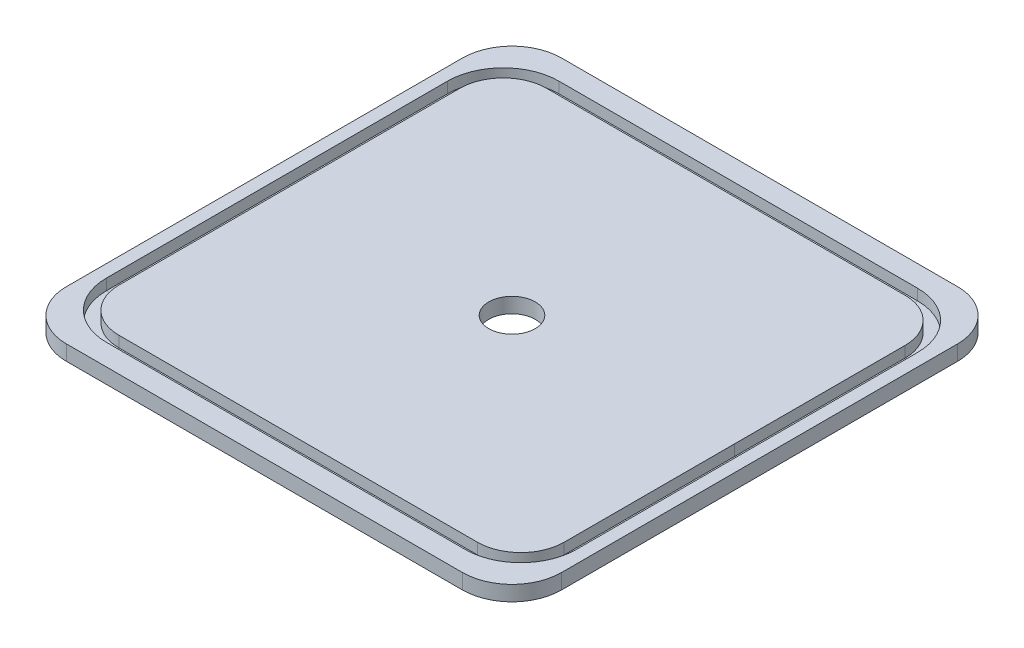
ISO-10303-21;
HEADER;
FILE_DESCRIPTION(('STEP AP214'),'2;1');
FILE_NAME('part.step','',(''),(''),'','','');
FILE_SCHEMA(('AUTOMOTIVE_DESIGN { 1 0 10303 214 1 1 1 1 }'));
ENDSEC;
DATA;
#1=APPLICATION_CONTEXT('core data for automotive mechanical design processes');
#2=APPLICATION_PROTOCOL_DEFINITION('international standard','automotive_design',2000,#1);
#3=PRODUCT_CONTEXT('',#1,'mechanical');
#4=PRODUCT('Part','Part','',(#3));
#5=PRODUCT_RELATED_PRODUCT_CATEGORY('part','',(#4));
#6=PRODUCT_DEFINITION_FORMATION('','',#4);
#7=PRODUCT_DEFINITION_CONTEXT('part definition',#1,'design');
#8=PRODUCT_DEFINITION('design','',#6,#7);
#9=PRODUCT_DEFINITION_SHAPE('','',#8);
#10=(LENGTH_UNIT() NAMED_UNIT(*) SI_UNIT(.MILLI.,.METRE.));
#11=(NAMED_UNIT(*) PLANE_ANGLE_UNIT() SI_UNIT($,.RADIAN.));
#12=(NAMED_UNIT(*) SI_UNIT($,.STERADIAN.) SOLID_ANGLE_UNIT());
#13=UNCERTAINTY_MEASURE_WITH_UNIT(LENGTH_MEASURE(1.E-05),#10,'distance_accuracy_value','');
#14=(GEOMETRIC_REPRESENTATION_CONTEXT(3) GLOBAL_UNCERTAINTY_ASSIGNED_CONTEXT((#13)) GLOBAL_UNIT_ASSIGNED_CONTEXT((#10,
#11,#12)) REPRESENTATION_CONTEXT('',''));
#15=CARTESIAN_POINT('',(0.,0.,0.));
#16=DIRECTION('',(0.,0.,1.));
#17=DIRECTION('',(1.,0.,0.));
#18=AXIS2_PLACEMENT_3D('',#15,#16,#17);
#19=CARTESIAN_POINT('',(50.8,1.94183,50.8));
#20=DIRECTION('',(0.,1.,0.));
#21=DIRECTION('',(0.,0.,1.));
#22=AXIS2_PLACEMENT_3D('',#19,#20,#21);
#23=PLANE('',#22);
#24=DIRECTION('',(0.,0.,1.));
#25=VECTOR('',#24,1.);
#26=CARTESIAN_POINT('',(60.2809892067048,1.94183,-43.7388));
#27=LINE('',#26,#25);
#28=CARTESIAN_POINT('',(60.2809892067048,1.94183,-43.7388));
#29=VERTEX_POINT('',#28);
#30=CARTESIAN_POINT('',(60.2809892067048,1.94183,0.));
#31=VERTEX_POINT('',#30);
#32=EDGE_CURVE('E364',#29,#31,#27,.T.);
#33=ORIENTED_EDGE('',*,*,#32,.T.);
#34=DIRECTION('',(0.,0.,1.));
#35=VECTOR('',#34,1.);
#36=CARTESIAN_POINT('',(60.2809892067048,1.94183,0.));
#37=LINE('',#36,#35);
#38=CARTESIAN_POINT('',(60.2809892067048,1.94183,43.7388));
#39=VERTEX_POINT('',#38);
#40=EDGE_CURVE('E253',#31,#39,#37,.T.);
#41=ORIENTED_EDGE('',*,*,#40,.T.);
#42=CARTESIAN_POINT('',(45.9922192067048,1.94183,43.7388));
#43=DIRECTION('',(0.,-1.,0.));
#44=DIRECTION('',(1.,0.,0.));
#45=AXIS2_PLACEMENT_3D('',#42,#43,#44);
#46=CIRCLE('',#45,14.28877);
#47=CARTESIAN_POINT('',(45.9922192067048,1.94183,58.02757));
#48=VERTEX_POINT('',#47);
#49=EDGE_CURVE('E264',#39,#48,#46,.T.);
#50=ORIENTED_EDGE('',*,*,#49,.T.);
#51=DIRECTION('',(-1.,0.,0.));
#52=VECTOR('',#51,1.);
#53=CARTESIAN_POINT('',(45.9922192067048,1.94183,58.02757));
#54=LINE('',#53,#52);
#55=CARTESIAN_POINT('',(-45.9922192067048,1.94183,58.02757));
#56=VERTEX_POINT('',#55);
#57=EDGE_CURVE('E275',#48,#56,#54,.T.);
#58=ORIENTED_EDGE('',*,*,#57,.T.);
#59=CARTESIAN_POINT('',(-45.9922192067048,1.94183,43.7388));
#60=DIRECTION('',(0.,-1.,0.));
#61=DIRECTION('',(0.,0.,1.));
#62=AXIS2_PLACEMENT_3D('',#59,#60,#61);
#63=CIRCLE('',#62,14.28877);
#64=CARTESIAN_POINT('',(-60.2809892067048,1.94183,43.7388));
#65=VERTEX_POINT('',#64);
#66=EDGE_CURVE('E286',#56,#65,#63,.T.);
#67=ORIENTED_EDGE('',*,*,#66,.T.);
#68=DIRECTION('',(0.,0.,-1.));
#69=VECTOR('',#68,1.);
#70=CARTESIAN_POINT('',(-60.2809892067048,1.94183,43.7388));
#71=LINE('',#70,#69);
#72=CARTESIAN_POINT('',(-60.2809892067048,1.94183,-43.7388));
#73=VERTEX_POINT('',#72);
#74=EDGE_CURVE('E280',#65,#73,#71,.T.);
#75=ORIENTED_EDGE('',*,*,#74,.T.);
#76=CARTESIAN_POINT('',(-45.9922192067048,1.94183,-43.7388));
#77=DIRECTION('',(0.,-1.,0.));
#78=DIRECTION('',(-1.,0.,0.));
#79=AXIS2_PLACEMENT_3D('',#76,#77,#78);
#80=CIRCLE('',#79,14.28877);
#81=CARTESIAN_POINT('',(-45.9922192067048,1.94183,-58.02757));
#82=VERTEX_POINT('',#81);
#83=EDGE_CURVE('E308',#73,#82,#80,.T.);
#84=ORIENTED_EDGE('',*,*,#83,.T.);
#85=DIRECTION('',(1.,0.,0.));
#86=VECTOR('',#85,1.);
#87=CARTESIAN_POINT('',(-45.9922192067048,1.94183,-58.02757));
#88=LINE('',#87,#86);
#89=CARTESIAN_POINT('',(45.9922192067048,1.94183,-58.02757));
#90=VERTEX_POINT('',#89);
#91=EDGE_CURVE('E315',#82,#90,#88,.T.);
#92=ORIENTED_EDGE('',*,*,#91,.T.);
#93=CARTESIAN_POINT('',(45.9922192067048,1.94183,-43.7388));
#94=DIRECTION('',(0.,-1.,0.));
#95=DIRECTION('',(0.,0.,-1.));
#96=AXIS2_PLACEMENT_3D('',#93,#94,#95);
#97=CIRCLE('',#96,14.28877);
#98=EDGE_CURVE('E218',#90,#29,#97,.T.);
#99=ORIENTED_EDGE('',*,*,#98,.T.);
#100=EDGE_LOOP('',(#33,#41,#50,#58,#67,#75,#84,#92,#99));
#101=FACE_BOUND('',#100,.T.);
#102=CARTESIAN_POINT('',(50.8,1.94183,50.8));
#103=DIRECTION('',(0.,1.,0.));
#104=DIRECTION('',(0.,0.,1.));
#105=AXIS2_PLACEMENT_3D('',#102,#103,#104);
#106=CIRCLE('',#105,12.7);
#107=CARTESIAN_POINT('',(50.8,1.94183,63.5));
#108=VERTEX_POINT('',#107);
#109=CARTESIAN_POINT('',(63.4999999999999,1.94183,50.8));
#110=VERTEX_POINT('',#109);
#111=EDGE_CURVE('E406',#108,#110,#106,.T.);
#112=ORIENTED_EDGE('',*,*,#111,.T.);
#113=DIRECTION('',(0.,0.,-1.));
#114=VECTOR('',#113,1.);
#115=CARTESIAN_POINT('',(63.4999999999999,1.94183,50.8));
#116=LINE('',#115,#114);
#117=CARTESIAN_POINT('',(63.4999999999999,1.94183,-50.8000000000001));
#118=VERTEX_POINT('',#117);
#119=EDGE_CURVE('E409',#110,#118,#116,.T.);
#120=ORIENTED_EDGE('',*,*,#119,.T.);
#121=CARTESIAN_POINT('',(50.7999999999999,1.94183,-50.8000000000001));
#122=DIRECTION('',(0.,1.,0.));
#123=DIRECTION('',(0.,0.,1.));
#124=AXIS2_PLACEMENT_3D('',#121,#122,#123);
#125=CIRCLE('',#124,12.7);
#126=CARTESIAN_POINT('',(50.7999999999999,1.94183,-63.5));
#127=VERTEX_POINT('',#126);
#128=EDGE_CURVE('E412',#118,#127,#125,.T.);
#129=ORIENTED_EDGE('',*,*,#128,.T.);
#130=DIRECTION('',(-1.,0.,0.));
#131=VECTOR('',#130,1.);
#132=CARTESIAN_POINT('',(50.7999999999999,1.94183,-63.5));
#133=LINE('',#132,#131);
#134=CARTESIAN_POINT('',(-50.7999999999999,1.94183,-63.5000000000001));
#135=VERTEX_POINT('',#134);
#136=EDGE_CURVE('E414',#127,#135,#133,.T.);
#137=ORIENTED_EDGE('',*,*,#136,.T.);
#138=CARTESIAN_POINT('',(-50.7999999999999,1.94183,-50.8));
#139=DIRECTION('',(0.,1.,0.));
#140=DIRECTION('',(0.,0.,-1.));
#141=AXIS2_PLACEMENT_3D('',#138,#139,#140);
#142=CIRCLE('',#141,12.7);
#143=CARTESIAN_POINT('',(-63.5,1.94183,-50.8));
#144=VERTEX_POINT('',#143);
#145=EDGE_CURVE('E416',#135,#144,#142,.T.);
#146=ORIENTED_EDGE('',*,*,#145,.T.);
#147=DIRECTION('',(0.,0.,1.));
#148=VECTOR('',#147,1.);
#149=CARTESIAN_POINT('',(-63.5,1.94183,-50.8));
#150=LINE('',#149,#148);
#151=CARTESIAN_POINT('',(-63.4999999999999,1.94183,50.8));
#152=VERTEX_POINT('',#151);
#153=EDGE_CURVE('E418',#144,#152,#150,.T.);
#154=ORIENTED_EDGE('',*,*,#153,.T.);
#155=CARTESIAN_POINT('',(-50.7999999999999,1.94183,50.8));
#156=DIRECTION('',(0.,1.,0.));
#157=DIRECTION('',(0.,0.,1.));
#158=AXIS2_PLACEMENT_3D('',#155,#156,#157);
#159=CIRCLE('',#158,12.7);
#160=CARTESIAN_POINT('',(-50.7999999999999,1.94183,63.5));
#161=VERTEX_POINT('',#160);
#162=EDGE_CURVE('E420',#152,#161,#159,.T.);
#163=ORIENTED_EDGE('',*,*,#162,.T.);
#164=DIRECTION('',(1.,0.,0.));
#165=VECTOR('',#164,1.);
#166=CARTESIAN_POINT('',(-50.7999999999999,1.94183,63.5));
#167=LINE('',#166,#165);
#168=EDGE_CURVE('E422',#161,#108,#167,.T.);
#169=ORIENTED_EDGE('',*,*,#168,.T.);
#170=EDGE_LOOP('',(#112,#120,#129,#137,#146,#154,#163,#169));
#171=FACE_BOUND('',#170,.T.);
#172=ADVANCED_FACE('F35',(#101,#171),#23,.T.);
#173=CARTESIAN_POINT('',(50.8,1.94183,50.8));
#174=DIRECTION('',(0.,-1.,0.));
#175=DIRECTION('',(0.,0.,-1.));
#176=AXIS2_PLACEMENT_3D('',#173,#174,#175);
#177=CYLINDRICAL_SURFACE('',#176,12.7);
#178=CARTESIAN_POINT('',(50.8,-1.94183,50.8));
#179=DIRECTION('',(0.,1.,0.));
#180=DIRECTION('',(0.,0.,1.));
#181=AXIS2_PLACEMENT_3D('',#178,#179,#180);
#182=CIRCLE('',#181,12.7);
#183=CARTESIAN_POINT('',(50.8,-1.94183,63.5));
#184=VERTEX_POINT('',#183);
#185=CARTESIAN_POINT('',(63.4999999999999,-1.94183,50.8));
#186=VERTEX_POINT('',#185);
#187=EDGE_CURVE('E405',#184,#186,#182,.T.);
#188=ORIENTED_EDGE('',*,*,#187,.T.);
#189=DIRECTION('',(0.,-1.,0.));
#190=VECTOR('',#189,1.);
#191=CARTESIAN_POINT('',(63.4999999999999,1.94183,50.8));
#192=LINE('',#191,#190);
#193=EDGE_CURVE('E11',#110,#186,#192,.T.);
#194=ORIENTED_EDGE('',*,*,#193,.F.);
#195=ORIENTED_EDGE('',*,*,#111,.F.);
#196=DIRECTION('',(0.,-1.,0.));
#197=VECTOR('',#196,1.);
#198=CARTESIAN_POINT('',(50.8,1.94183,63.5));
#199=LINE('',#198,#197);
#200=EDGE_CURVE('E424',#108,#184,#199,.T.);
#201=ORIENTED_EDGE('',*,*,#200,.T.);
#202=EDGE_LOOP('',(#188,#194,#195,#201));
#203=FACE_BOUND('',#202,.T.);
#204=ADVANCED_FACE('F37',(#203),#177,.T.);
#205=CARTESIAN_POINT('',(63.4999999999999,1.94183,50.8));
#206=DIRECTION('',(-1.,0.,0.));
#207=DIRECTION('',(0.,0.,1.));
#208=AXIS2_PLACEMENT_3D('',#205,#206,#207);
#209=PLANE('',#208);
#210=DIRECTION('',(0.,0.,-1.));
#211=VECTOR('',#210,1.);
#212=CARTESIAN_POINT('',(63.4999999999999,-1.94183,50.8));
#213=LINE('',#212,#211);
#214=CARTESIAN_POINT('',(63.4999999999999,-1.94183,-50.8000000000001));
#215=VERTEX_POINT('',#214);
#216=EDGE_CURVE('E427',#186,#215,#213,.T.);
#217=ORIENTED_EDGE('',*,*,#216,.T.);
#218=DIRECTION('',(0.,-1.,0.));
#219=VECTOR('',#218,1.);
#220=CARTESIAN_POINT('',(63.4999999999999,1.94183,-50.8000000000001));
#221=LINE('',#220,#219);
#222=EDGE_CURVE('E43',#118,#215,#221,.T.);
#223=ORIENTED_EDGE('',*,*,#222,.F.);
#224=ORIENTED_EDGE('',*,*,#119,.F.);
#225=ORIENTED_EDGE('',*,*,#193,.T.);
#226=EDGE_LOOP('',(#217,#223,#224,#225));
#227=FACE_BOUND('',#226,.T.);
#228=ADVANCED_FACE('F483',(#227),#209,.F.);
#229=CARTESIAN_POINT('',(50.7999999999999,1.94183,-50.8000000000001));
#230=DIRECTION('',(0.,-1.,0.));
#231=DIRECTION('',(0.,0.,-1.));
#232=AXIS2_PLACEMENT_3D('',#229,#230,#231);
#233=CYLINDRICAL_SURFACE('',#232,12.7);
#234=CARTESIAN_POINT('',(50.7999999999999,-1.94183,-50.8000000000001));
#235=DIRECTION('',(0.,1.,0.));
#236=DIRECTION('',(0.,0.,1.));
#237=AXIS2_PLACEMENT_3D('',#234,#235,#236);
#238=CIRCLE('',#237,12.7);
#239=CARTESIAN_POINT('',(50.7999999999999,-1.94183,-63.5));
#240=VERTEX_POINT('',#239);
#241=EDGE_CURVE('E429',#215,#240,#238,.T.);
#242=ORIENTED_EDGE('',*,*,#241,.T.);
#243=DIRECTION('',(0.,-1.,0.));
#244=VECTOR('',#243,1.);
#245=CARTESIAN_POINT('',(50.7999999999999,1.94183,-63.5));
#246=LINE('',#245,#244);
#247=EDGE_CURVE('E454',#127,#240,#246,.T.);
#248=ORIENTED_EDGE('',*,*,#247,.F.);
#249=ORIENTED_EDGE('',*,*,#128,.F.);
#250=ORIENTED_EDGE('',*,*,#222,.T.);
#251=EDGE_LOOP('',(#242,#248,#249,#250));
#252=FACE_BOUND('',#251,.T.);
#253=ADVANCED_FACE('F461',(#252),#233,.T.);
#254=CARTESIAN_POINT('',(50.7999999999999,1.94183,-63.5));
#255=DIRECTION('',(0.,0.,1.));
#256=DIRECTION('',(1.,0.,0.));
#257=AXIS2_PLACEMENT_3D('',#254,#255,#256);
#258=PLANE('',#257);
#259=DIRECTION('',(-1.,0.,0.));
#260=VECTOR('',#259,1.);
#261=CARTESIAN_POINT('',(50.7999999999999,-1.94183,-63.5));
#262=LINE('',#261,#260);
#263=CARTESIAN_POINT('',(-50.7999999999999,-1.94183,-63.5000000000001));
#264=VERTEX_POINT('',#263);
#265=EDGE_CURVE('E431',#240,#264,#262,.T.);
#266=ORIENTED_EDGE('',*,*,#265,.T.);
#267=DIRECTION('',(0.,-1.,0.));
#268=VECTOR('',#267,1.);
#269=CARTESIAN_POINT('',(-50.7999999999999,1.94183,-63.5000000000001));
#270=LINE('',#269,#268);
#271=EDGE_CURVE('E451',#135,#264,#270,.T.);
#272=ORIENTED_EDGE('',*,*,#271,.F.);
#273=ORIENTED_EDGE('',*,*,#136,.F.);
#274=ORIENTED_EDGE('',*,*,#247,.T.);
#275=EDGE_LOOP('',(#266,#272,#273,#274));
#276=FACE_BOUND('',#275,.T.);
#277=ADVANCED_FACE('F472',(#276),#258,.F.);
#278=CARTESIAN_POINT('',(-50.7999999999999,1.94183,-50.8));
#279=DIRECTION('',(0.,-1.,0.));
#280=DIRECTION('',(0.,0.,-1.));
#281=AXIS2_PLACEMENT_3D('',#278,#279,#280);
#282=CYLINDRICAL_SURFACE('',#281,12.7);
#283=CARTESIAN_POINT('',(-50.7999999999999,-1.94183,-50.8));
#284=DIRECTION('',(0.,1.,0.));
#285=DIRECTION('',(0.,0.,-1.));
#286=AXIS2_PLACEMENT_3D('',#283,#284,#285);
#287=CIRCLE('',#286,12.7);
#288=CARTESIAN_POINT('',(-63.5,-1.94183,-50.8));
#289=VERTEX_POINT('',#288);
#290=EDGE_CURVE('E433',#264,#289,#287,.T.);
#291=ORIENTED_EDGE('',*,*,#290,.T.);
#292=DIRECTION('',(0.,-1.,0.));
#293=VECTOR('',#292,1.);
#294=CARTESIAN_POINT('',(-63.5,1.94183,-50.8));
#295=LINE('',#294,#293);
#296=EDGE_CURVE('E448',#144,#289,#295,.T.);
#297=ORIENTED_EDGE('',*,*,#296,.F.);
#298=ORIENTED_EDGE('',*,*,#145,.F.);
#299=ORIENTED_EDGE('',*,*,#271,.T.);
#300=EDGE_LOOP('',(#291,#297,#298,#299));
#301=FACE_BOUND('',#300,.T.);
#302=ADVANCED_FACE('F476',(#301),#282,.T.);
#303=CARTESIAN_POINT('',(-63.5,1.94183,-50.8));
#304=DIRECTION('',(1.,0.,0.));
#305=DIRECTION('',(0.,0.,-1.));
#306=AXIS2_PLACEMENT_3D('',#303,#304,#305);
#307=PLANE('',#306);
#308=DIRECTION('',(0.,0.,1.));
#309=VECTOR('',#308,1.);
#310=CARTESIAN_POINT('',(-63.5,-1.94183,-50.8));
#311=LINE('',#310,#309);
#312=CARTESIAN_POINT('',(-63.4999999999999,-1.94183,50.8));
#313=VERTEX_POINT('',#312);
#314=EDGE_CURVE('E435',#289,#313,#311,.T.);
#315=ORIENTED_EDGE('',*,*,#314,.T.);
#316=DIRECTION('',(0.,-1.,0.));
#317=VECTOR('',#316,1.);
#318=CARTESIAN_POINT('',(-63.4999999999999,1.94183,50.8));
#319=LINE('',#318,#317);
#320=EDGE_CURVE('E445',#152,#313,#319,.T.);
#321=ORIENTED_EDGE('',*,*,#320,.F.);
#322=ORIENTED_EDGE('',*,*,#153,.F.);
#323=ORIENTED_EDGE('',*,*,#296,.T.);
#324=EDGE_LOOP('',(#315,#321,#322,#323));
#325=FACE_BOUND('',#324,.T.);
#326=ADVANCED_FACE('F496',(#325),#307,.F.);
#327=CARTESIAN_POINT('',(-50.7999999999999,1.94183,50.8));
#328=DIRECTION('',(0.,-1.,0.));
#329=DIRECTION('',(0.,0.,-1.));
#330=AXIS2_PLACEMENT_3D('',#327,#328,#329);
#331=CYLINDRICAL_SURFACE('',#330,12.7);
#332=CARTESIAN_POINT('',(-50.7999999999999,-1.94183,50.8));
#333=DIRECTION('',(0.,1.,0.));
#334=DIRECTION('',(0.,0.,1.));
#335=AXIS2_PLACEMENT_3D('',#332,#333,#334);
#336=CIRCLE('',#335,12.7);
#337=CARTESIAN_POINT('',(-50.7999999999999,-1.94183,63.5));
#338=VERTEX_POINT('',#337);
#339=EDGE_CURVE('E437',#313,#338,#336,.T.);
#340=ORIENTED_EDGE('',*,*,#339,.T.);
#341=DIRECTION('',(0.,-1.,0.));
#342=VECTOR('',#341,1.);
#343=CARTESIAN_POINT('',(-50.7999999999999,1.94183,63.5));
#344=LINE('',#343,#342);
#345=EDGE_CURVE('E442',#161,#338,#344,.T.);
#346=ORIENTED_EDGE('',*,*,#345,.F.);
#347=ORIENTED_EDGE('',*,*,#162,.F.);
#348=ORIENTED_EDGE('',*,*,#320,.T.);
#349=EDGE_LOOP('',(#340,#346,#347,#348));
#350=FACE_BOUND('',#349,.T.);
#351=ADVANCED_FACE('F494',(#350),#331,.T.);
#352=CARTESIAN_POINT('',(-50.7999999999999,1.94183,63.5));
#353=DIRECTION('',(0.,0.,-1.));
#354=DIRECTION('',(-1.,0.,0.));
#355=AXIS2_PLACEMENT_3D('',#352,#353,#354);
#356=PLANE('',#355);
#357=DIRECTION('',(1.,0.,0.));
#358=VECTOR('',#357,1.);
#359=CARTESIAN_POINT('',(-50.7999999999999,-1.94183,63.5));
#360=LINE('',#359,#358);
#361=EDGE_CURVE('E410',#338,#184,#360,.T.);
#362=ORIENTED_EDGE('',*,*,#361,.T.);
#363=ORIENTED_EDGE('',*,*,#200,.F.);
#364=ORIENTED_EDGE('',*,*,#168,.F.);
#365=ORIENTED_EDGE('',*,*,#345,.T.);
#366=EDGE_LOOP('',(#362,#363,#364,#365));
#367=FACE_BOUND('',#366,.T.);
#368=ADVANCED_FACE('F489',(#367),#356,.F.);
#369=CARTESIAN_POINT('',(45.9922192067048,1.94183,-43.7388));
#370=DIRECTION('',(0.,-1.,0.));
#371=DIRECTION('',(0.,0.,-1.));
#372=AXIS2_PLACEMENT_3D('',#369,#370,#371);
#373=CIRCLE('',#372,11.11123);
#374=CARTESIAN_POINT('',(45.9922192067048,1.94183,-54.85003));
#375=VERTEX_POINT('',#374);
#376=CARTESIAN_POINT('',(57.1034492067048,1.94183,-43.7388));
#377=VERTEX_POINT('',#376);
#378=EDGE_CURVE('E58',#375,#377,#373,.T.);
#379=ORIENTED_EDGE('',*,*,#378,.F.);
#380=DIRECTION('',(1.,0.,0.));
#381=VECTOR('',#380,1.);
#382=CARTESIAN_POINT('',(-45.9922192067048,1.94183,-54.85003));
#383=LINE('',#382,#381);
#384=CARTESIAN_POINT('',(-45.9922192067048,1.94183,-54.85003));
#385=VERTEX_POINT('',#384);
#386=EDGE_CURVE('E302',#385,#375,#383,.T.);
#387=ORIENTED_EDGE('',*,*,#386,.F.);
#388=CARTESIAN_POINT('',(-45.9922192067048,1.94183,-43.7388));
#389=DIRECTION('',(0.,-1.,0.));
#390=DIRECTION('',(-1.,0.,0.));
#391=AXIS2_PLACEMENT_3D('',#388,#389,#390);
#392=CIRCLE('',#391,11.11123);
#393=CARTESIAN_POINT('',(-57.1034492067048,1.94183,-43.7388));
#394=VERTEX_POINT('',#393);
#395=EDGE_CURVE('E291',#394,#385,#392,.T.);
#396=ORIENTED_EDGE('',*,*,#395,.F.);
#397=DIRECTION('',(0.,0.,-1.));
#398=VECTOR('',#397,1.);
#399=CARTESIAN_POINT('',(-57.1034492067048,1.94183,43.7388));
#400=LINE('',#399,#398);
#401=CARTESIAN_POINT('',(-57.1034492067048,1.94183,43.7388));
#402=VERTEX_POINT('',#401);
#403=EDGE_CURVE('E284',#402,#394,#400,.T.);
#404=ORIENTED_EDGE('',*,*,#403,.F.);
#405=CARTESIAN_POINT('',(-45.9922192067048,1.94183,43.7388));
#406=DIRECTION('',(0.,-1.,0.));
#407=DIRECTION('',(0.,0.,1.));
#408=AXIS2_PLACEMENT_3D('',#405,#406,#407);
#409=CIRCLE('',#408,11.11123);
#410=CARTESIAN_POINT('',(-45.9922192067048,1.94183,54.85003));
#411=VERTEX_POINT('',#410);
#412=EDGE_CURVE('E269',#411,#402,#409,.T.);
#413=ORIENTED_EDGE('',*,*,#412,.F.);
#414=DIRECTION('',(-1.,0.,0.));
#415=VECTOR('',#414,1.);
#416=CARTESIAN_POINT('',(45.9922192067048,1.94183,54.85003));
#417=LINE('',#416,#415);
#418=CARTESIAN_POINT('',(45.9922192067048,1.94183,54.85003));
#419=VERTEX_POINT('',#418);
#420=EDGE_CURVE('E258',#419,#411,#417,.T.);
#421=ORIENTED_EDGE('',*,*,#420,.F.);
#422=CARTESIAN_POINT('',(45.9922192067048,1.94183,43.7388));
#423=DIRECTION('',(0.,-1.,0.));
#424=DIRECTION('',(1.,0.,0.));
#425=AXIS2_PLACEMENT_3D('',#422,#423,#424);
#426=CIRCLE('',#425,11.11123);
#427=CARTESIAN_POINT('',(57.1034492067048,1.94183,43.7388));
#428=VERTEX_POINT('',#427);
#429=EDGE_CURVE('E236',#428,#419,#426,.T.);
#430=ORIENTED_EDGE('',*,*,#429,.F.);
#431=DIRECTION('',(0.,0.,1.));
#432=VECTOR('',#431,1.);
#433=CARTESIAN_POINT('',(57.1034492067048,1.94183,0.));
#434=LINE('',#433,#432);
#435=CARTESIAN_POINT('',(57.1034492067048,1.94183,0.));
#436=VERTEX_POINT('',#435);
#437=EDGE_CURVE('E225',#436,#428,#434,.T.);
#438=ORIENTED_EDGE('',*,*,#437,.F.);
#439=DIRECTION('',(0.,0.,1.));
#440=VECTOR('',#439,1.);
#441=CARTESIAN_POINT('',(57.1034492067048,1.94183,-43.7388));
#442=LINE('',#441,#440);
#443=EDGE_CURVE('E210',#377,#436,#442,.T.);
#444=ORIENTED_EDGE('',*,*,#443,.F.);
#445=EDGE_LOOP('',(#379,#387,#396,#404,#413,#421,#430,#438,#444));
#446=FACE_BOUND('',#445,.T.);
#447=CARTESIAN_POINT('',(0.,1.94183,0.));
#448=DIRECTION('',(0.,1.,0.));
#449=DIRECTION('',(0.,0.,1.));
#450=AXIS2_PLACEMENT_3D('',#447,#448,#449);
#451=CIRCLE('',#450,5.953125);
#452=CARTESIAN_POINT('',(0.,1.94183,5.95312499999999));
#453=VERTEX_POINT('',#452);
#454=EDGE_CURVE('E399',#453,#453,#451,.T.);
#455=ORIENTED_EDGE('',*,*,#454,.F.);
#456=EDGE_LOOP('',(#455));
#457=FACE_BOUND('',#456,.T.);
#458=ADVANCED_FACE('F232',(#446,#457),#23,.T.);
#459=CARTESIAN_POINT('',(50.8,-1.94183,50.8));
#460=DIRECTION('',(0.,1.,0.));
#461=DIRECTION('',(0.,0.,1.));
#462=AXIS2_PLACEMENT_3D('',#459,#460,#461);
#463=PLANE('',#462);
#464=CARTESIAN_POINT('',(0.,-1.94183,0.));
#465=DIRECTION('',(0.,1.,0.));
#466=DIRECTION('',(0.,0.,1.));
#467=AXIS2_PLACEMENT_3D('',#464,#465,#466);
#468=CIRCLE('',#467,5.953125);
#469=CARTESIAN_POINT('',(0.,-1.94183,5.95312499999999));
#470=VERTEX_POINT('',#469);
#471=EDGE_CURVE('E402',#470,#470,#468,.F.);
#472=ORIENTED_EDGE('',*,*,#471,.F.);
#473=EDGE_LOOP('',(#472));
#474=FACE_BOUND('',#473,.T.);
#475=ORIENTED_EDGE('',*,*,#187,.F.);
#476=ORIENTED_EDGE('',*,*,#361,.F.);
#477=ORIENTED_EDGE('',*,*,#339,.F.);
#478=ORIENTED_EDGE('',*,*,#314,.F.);
#479=ORIENTED_EDGE('',*,*,#290,.F.);
#480=ORIENTED_EDGE('',*,*,#265,.F.);
#481=ORIENTED_EDGE('',*,*,#241,.F.);
#482=ORIENTED_EDGE('',*,*,#216,.F.);
#483=EDGE_LOOP('',(#475,#476,#477,#478,#479,#480,#481,#482));
#484=FACE_BOUND('',#483,.T.);
#485=ADVANCED_FACE('F467',(#474,#484),#463,.F.);
#486=CARTESIAN_POINT('',(0.,-18.7798102270047,0.));
#487=DIRECTION('',(0.,1.,0.));
#488=DIRECTION('',(0.,0.,1.));
#489=AXIS2_PLACEMENT_3D('',#486,#487,#488);
#490=CYLINDRICAL_SURFACE('',#489,5.953125);
#491=ORIENTED_EDGE('',*,*,#471,.T.);
#492=EDGE_LOOP('',(#491));
#493=FACE_BOUND('',#492,.T.);
#494=ORIENTED_EDGE('',*,*,#454,.T.);
#495=EDGE_LOOP('',(#494));
#496=FACE_BOUND('',#495,.T.);
#497=ADVANCED_FACE('F518',(#493,#496),#490,.F.);
#498=CARTESIAN_POINT('',(60.2809892067048,1.94183,-43.7388));
#499=DIRECTION('',(1.,0.,0.));
#500=DIRECTION('',(0.,0.,-1.));
#501=AXIS2_PLACEMENT_3D('',#498,#499,#500);
#502=PLANE('',#501);
#503=DIRECTION('',(0.,0.,1.));
#504=VECTOR('',#503,1.);
#505=CARTESIAN_POINT('',(60.2809892067048,-0.88265,-43.7388));
#506=LINE('',#505,#504);
#507=CARTESIAN_POINT('',(60.2809892067048,-0.88265,-43.7388));
#508=VERTEX_POINT('',#507);
#509=CARTESIAN_POINT('',(60.2809892067048,-0.88265,0.));
#510=VERTEX_POINT('',#509);
#511=EDGE_CURVE('E316',#508,#510,#506,.T.);
#512=ORIENTED_EDGE('',*,*,#511,.T.);
#513=DIRECTION('',(0.,1.,0.));
#514=VECTOR('',#513,1.);
#515=CARTESIAN_POINT('',(60.2809892067048,1.94183,0.));
#516=LINE('',#515,#514);
#517=EDGE_CURVE('E238',#510,#31,#516,.T.);
#518=ORIENTED_EDGE('',*,*,#517,.T.);
#519=ORIENTED_EDGE('',*,*,#32,.F.);
#520=DIRECTION('',(0.,1.,0.));
#521=VECTOR('',#520,1.);
#522=CARTESIAN_POINT('',(60.2809892067048,1.94183,-43.7388));
#523=LINE('',#522,#521);
#524=EDGE_CURVE('E363',#508,#29,#523,.T.);
#525=ORIENTED_EDGE('',*,*,#524,.F.);
#526=EDGE_LOOP('',(#512,#518,#519,#525));
#527=FACE_BOUND('',#526,.T.);
#528=ADVANCED_FACE('F588',(#527),#502,.F.);
#529=CARTESIAN_POINT('',(60.2809892067048,-0.88265,-43.7388));
#530=DIRECTION('',(0.,-1.,0.));
#531=DIRECTION('',(1.,0.,0.));
#532=AXIS2_PLACEMENT_3D('',#529,#530,#531);
#533=PLANE('',#532);
#534=DIRECTION('',(0.,0.,1.));
#535=VECTOR('',#534,1.);
#536=CARTESIAN_POINT('',(57.1034492067048,-0.88265,-43.7388));
#537=LINE('',#536,#535);
#538=CARTESIAN_POINT('',(57.1034492067048,-0.882650000000001,-43.7388));
#539=VERTEX_POINT('',#538);
#540=CARTESIAN_POINT('',(57.1034492067048,-0.88265,0.));
#541=VERTEX_POINT('',#540);
#542=EDGE_CURVE('E217',#539,#541,#537,.T.);
#543=ORIENTED_EDGE('',*,*,#542,.T.);
#544=DIRECTION('',(1.,0.,0.));
#545=VECTOR('',#544,1.);
#546=CARTESIAN_POINT('',(60.2809892067048,-0.88265,0.));
#547=LINE('',#546,#545);
#548=EDGE_CURVE('E230',#541,#510,#547,.T.);
#549=ORIENTED_EDGE('',*,*,#548,.T.);
#550=ORIENTED_EDGE('',*,*,#511,.F.);
#551=DIRECTION('',(1.,0.,0.));
#552=VECTOR('',#551,1.);
#553=CARTESIAN_POINT('',(60.2809892067048,-0.88265,-43.7388));
#554=LINE('',#553,#552);
#555=EDGE_CURVE('E313',#539,#508,#554,.T.);
#556=ORIENTED_EDGE('',*,*,#555,.F.);
#557=EDGE_LOOP('',(#543,#549,#550,#556));
#558=FACE_BOUND('',#557,.T.);
#559=ADVANCED_FACE('F599',(#558),#533,.F.);
#560=CARTESIAN_POINT('',(45.9922192067048,1.94183,-43.7388));
#561=DIRECTION('',(0.,-1.,0.));
#562=DIRECTION('',(0.,0.,-1.));
#563=AXIS2_PLACEMENT_3D('',#560,#561,#562);
#564=CYLINDRICAL_SURFACE('',#563,14.28877);
#565=ORIENTED_EDGE('',*,*,#98,.F.);
#566=DIRECTION('',(0.,1.,0.));
#567=VECTOR('',#566,1.);
#568=CARTESIAN_POINT('',(45.9922192067048,1.94183,-58.02757));
#569=LINE('',#568,#567);
#570=CARTESIAN_POINT('',(45.9922192067048,-0.88265,-58.02757));
#571=VERTEX_POINT('',#570);
#572=EDGE_CURVE('E357',#571,#90,#569,.T.);
#573=ORIENTED_EDGE('',*,*,#572,.F.);
#574=CARTESIAN_POINT('',(45.9922192067048,-0.88265,-43.7388));
#575=DIRECTION('',(0.,-1.,0.));
#576=DIRECTION('',(0.,0.,-1.));
#577=AXIS2_PLACEMENT_3D('',#574,#575,#576);
#578=CIRCLE('',#577,14.28877);
#579=EDGE_CURVE('E360',#571,#508,#578,.T.);
#580=ORIENTED_EDGE('',*,*,#579,.T.);
#581=ORIENTED_EDGE('',*,*,#524,.T.);
#582=EDGE_LOOP('',(#565,#573,#580,#581));
#583=FACE_BOUND('',#582,.T.);
#584=ADVANCED_FACE('F608',(#583),#564,.F.);
#585=CARTESIAN_POINT('',(45.9922192067048,-0.88265,-58.02757));
#586=DIRECTION('',(0.,-1.,0.));
#587=DIRECTION('',(0.,0.,-1.));
#588=AXIS2_PLACEMENT_3D('',#585,#586,#587);
#589=PLANE('',#588);
#590=ORIENTED_EDGE('',*,*,#579,.F.);
#591=DIRECTION('',(0.,0.,-1.));
#592=VECTOR('',#591,1.);
#593=CARTESIAN_POINT('',(45.9922192067048,-0.88265,-58.02757));
#594=LINE('',#593,#592);
#595=CARTESIAN_POINT('',(45.9922192067048,-0.88265,-54.85003));
#596=VERTEX_POINT('',#595);
#597=EDGE_CURVE('E305',#596,#571,#594,.T.);
#598=ORIENTED_EDGE('',*,*,#597,.F.);
#599=CARTESIAN_POINT('',(45.9922192067048,-0.882650000000001,-43.7388));
#600=DIRECTION('',(0.,-1.,0.));
#601=DIRECTION('',(0.,0.,-1.));
#602=AXIS2_PLACEMENT_3D('',#599,#600,#601);
#603=CIRCLE('',#602,11.11123);
#604=EDGE_CURVE('E310',#596,#539,#603,.T.);
#605=ORIENTED_EDGE('',*,*,#604,.T.);
#606=ORIENTED_EDGE('',*,*,#555,.T.);
#607=EDGE_LOOP('',(#590,#598,#605,#606));
#608=FACE_BOUND('',#607,.T.);
#609=ADVANCED_FACE('F617',(#608),#589,.F.);
#610=CARTESIAN_POINT('',(45.9922192067048,1.94183,-43.7388));
#611=DIRECTION('',(0.,-1.,0.));
#612=DIRECTION('',(0.,0.,-1.));
#613=AXIS2_PLACEMENT_3D('',#610,#611,#612);
#614=CYLINDRICAL_SURFACE('',#613,11.11123);
#615=ORIENTED_EDGE('',*,*,#604,.F.);
#616=DIRECTION('',(0.,-1.,0.));
#617=VECTOR('',#616,1.);
#618=CARTESIAN_POINT('',(45.9922192067048,1.94183,-54.85003));
#619=LINE('',#618,#617);
#620=EDGE_CURVE('E298',#375,#596,#619,.T.);
#621=ORIENTED_EDGE('',*,*,#620,.F.);
#622=ORIENTED_EDGE('',*,*,#378,.T.);
#623=DIRECTION('',(0.,-1.,0.));
#624=VECTOR('',#623,1.);
#625=CARTESIAN_POINT('',(57.1034492067048,1.94183,-43.7388));
#626=LINE('',#625,#624);
#627=EDGE_CURVE('E214',#377,#539,#626,.T.);
#628=ORIENTED_EDGE('',*,*,#627,.T.);
#629=EDGE_LOOP('',(#615,#621,#622,#628));
#630=FACE_BOUND('',#629,.T.);
#631=ADVANCED_FACE('F626',(#630),#614,.T.);
#632=CARTESIAN_POINT('',(-45.9922192067048,1.94183,-58.02757));
#633=DIRECTION('',(0.,0.,-1.));
#634=DIRECTION('',(-1.,0.,0.));
#635=AXIS2_PLACEMENT_3D('',#632,#633,#634);
#636=PLANE('',#635);
#637=ORIENTED_EDGE('',*,*,#91,.F.);
#638=DIRECTION('',(0.,1.,0.));
#639=VECTOR('',#638,1.);
#640=CARTESIAN_POINT('',(-45.9922192067048,1.94183,-58.02757));
#641=LINE('',#640,#639);
#642=CARTESIAN_POINT('',(-45.9922192067048,-0.88265,-58.02757));
#643=VERTEX_POINT('',#642);
#644=EDGE_CURVE('E351',#643,#82,#641,.T.);
#645=ORIENTED_EDGE('',*,*,#644,.F.);
#646=DIRECTION('',(1.,0.,0.));
#647=VECTOR('',#646,1.);
#648=CARTESIAN_POINT('',(-45.9922192067048,-0.88265,-58.02757));
#649=LINE('',#648,#647);
#650=EDGE_CURVE('E354',#643,#571,#649,.T.);
#651=ORIENTED_EDGE('',*,*,#650,.T.);
#652=ORIENTED_EDGE('',*,*,#572,.T.);
#653=EDGE_LOOP('',(#637,#645,#651,#652));
#654=FACE_BOUND('',#653,.T.);
#655=ADVANCED_FACE('F635',(#654),#636,.F.);
#656=CARTESIAN_POINT('',(-45.9922192067048,-0.88265,-58.02757));
#657=DIRECTION('',(0.,-1.,0.));
#658=DIRECTION('',(0.,0.,-1.));
#659=AXIS2_PLACEMENT_3D('',#656,#657,#658);
#660=PLANE('',#659);
#661=ORIENTED_EDGE('',*,*,#650,.F.);
#662=DIRECTION('',(0.,0.,-1.));
#663=VECTOR('',#662,1.);
#664=CARTESIAN_POINT('',(-45.9922192067048,-0.88265,-58.02757));
#665=LINE('',#664,#663);
#666=CARTESIAN_POINT('',(-45.9922192067048,-0.882650000000001,-54.85003));
#667=VERTEX_POINT('',#666);
#668=EDGE_CURVE('E294',#667,#643,#665,.T.);
#669=ORIENTED_EDGE('',*,*,#668,.F.);
#670=DIRECTION('',(1.,0.,0.));
#671=VECTOR('',#670,1.);
#672=CARTESIAN_POINT('',(-45.9922192067048,-0.88265,-54.85003));
#673=LINE('',#672,#671);
#674=EDGE_CURVE('E301',#667,#596,#673,.T.);
#675=ORIENTED_EDGE('',*,*,#674,.T.);
#676=ORIENTED_EDGE('',*,*,#597,.T.);
#677=EDGE_LOOP('',(#661,#669,#675,#676));
#678=FACE_BOUND('',#677,.T.);
#679=ADVANCED_FACE('F643',(#678),#660,.F.);
#680=CARTESIAN_POINT('',(-45.9922192067048,1.94183,-54.85003));
#681=DIRECTION('',(0.,0.,1.));
#682=DIRECTION('',(1.,0.,0.));
#683=AXIS2_PLACEMENT_3D('',#680,#681,#682);
#684=PLANE('',#683);
#685=ORIENTED_EDGE('',*,*,#674,.F.);
#686=DIRECTION('',(0.,-1.,0.));
#687=VECTOR('',#686,1.);
#688=CARTESIAN_POINT('',(-45.9922192067048,1.94183,-54.85003));
#689=LINE('',#688,#687);
#690=EDGE_CURVE('E287',#385,#667,#689,.T.);
#691=ORIENTED_EDGE('',*,*,#690,.F.);
#692=ORIENTED_EDGE('',*,*,#386,.T.);
#693=ORIENTED_EDGE('',*,*,#620,.T.);
#694=EDGE_LOOP('',(#685,#691,#692,#693));
#695=FACE_BOUND('',#694,.T.);
#696=ADVANCED_FACE('F652',(#695),#684,.F.);
#697=CARTESIAN_POINT('',(-45.9922192067048,1.94183,-43.7388));
#698=DIRECTION('',(0.,-1.,0.));
#699=DIRECTION('',(0.,0.,-1.));
#700=AXIS2_PLACEMENT_3D('',#697,#698,#699);
#701=CYLINDRICAL_SURFACE('',#700,14.28877);
#702=ORIENTED_EDGE('',*,*,#83,.F.);
#703=DIRECTION('',(0.,1.,0.));
#704=VECTOR('',#703,1.);
#705=CARTESIAN_POINT('',(-60.2809892067048,1.94183,-43.7388));
#706=LINE('',#705,#704);
#707=CARTESIAN_POINT('',(-60.2809892067048,-0.88265,-43.7388));
#708=VERTEX_POINT('',#707);
#709=EDGE_CURVE('E297',#708,#73,#706,.T.);
#710=ORIENTED_EDGE('',*,*,#709,.F.);
#711=CARTESIAN_POINT('',(-45.9922192067048,-0.88265,-43.7388));
#712=DIRECTION('',(0.,-1.,0.));
#713=DIRECTION('',(-1.,0.,0.));
#714=AXIS2_PLACEMENT_3D('',#711,#712,#713);
#715=CIRCLE('',#714,14.28877);
#716=EDGE_CURVE('E348',#708,#643,#715,.T.);
#717=ORIENTED_EDGE('',*,*,#716,.T.);
#718=ORIENTED_EDGE('',*,*,#644,.T.);
#719=EDGE_LOOP('',(#702,#710,#717,#718));
#720=FACE_BOUND('',#719,.T.);
#721=ADVANCED_FACE('F661',(#720),#701,.F.);
#722=CARTESIAN_POINT('',(-60.2809892067048,-0.88265,-43.7388));
#723=DIRECTION('',(0.,-1.,0.));
#724=DIRECTION('',(0.,0.,-1.));
#725=AXIS2_PLACEMENT_3D('',#722,#723,#724);
#726=PLANE('',#725);
#727=ORIENTED_EDGE('',*,*,#716,.F.);
#728=DIRECTION('',(-1.,0.,0.));
#729=VECTOR('',#728,1.);
#730=CARTESIAN_POINT('',(-60.2809892067048,-0.88265,-43.7388));
#731=LINE('',#730,#729);
#732=CARTESIAN_POINT('',(-57.1034492067048,-0.88265,-43.7388));
#733=VERTEX_POINT('',#732);
#734=EDGE_CURVE('E279',#733,#708,#731,.T.);
#735=ORIENTED_EDGE('',*,*,#734,.F.);
#736=CARTESIAN_POINT('',(-45.9922192067048,-0.882650000000001,-43.7388));
#737=DIRECTION('',(0.,-1.,0.));
#738=DIRECTION('',(-1.,0.,0.));
#739=AXIS2_PLACEMENT_3D('',#736,#737,#738);
#740=CIRCLE('',#739,11.11123);
#741=EDGE_CURVE('E290',#733,#667,#740,.T.);
#742=ORIENTED_EDGE('',*,*,#741,.T.);
#743=ORIENTED_EDGE('',*,*,#668,.T.);
#744=EDGE_LOOP('',(#727,#735,#742,#743));
#745=FACE_BOUND('',#744,.T.);
#746=ADVANCED_FACE('F670',(#745),#726,.F.);
#747=CARTESIAN_POINT('',(-45.9922192067048,1.94183,-43.7388));
#748=DIRECTION('',(0.,-1.,0.));
#749=DIRECTION('',(0.,0.,-1.));
#750=AXIS2_PLACEMENT_3D('',#747,#748,#749);
#751=CYLINDRICAL_SURFACE('',#750,11.11123);
#752=ORIENTED_EDGE('',*,*,#741,.F.);
#753=DIRECTION('',(0.,-1.,0.));
#754=VECTOR('',#753,1.);
#755=CARTESIAN_POINT('',(-57.1034492067048,1.94183,-43.7388));
#756=LINE('',#755,#754);
#757=EDGE_CURVE('E276',#394,#733,#756,.T.);
#758=ORIENTED_EDGE('',*,*,#757,.F.);
#759=ORIENTED_EDGE('',*,*,#395,.T.);
#760=ORIENTED_EDGE('',*,*,#690,.T.);
#761=EDGE_LOOP('',(#752,#758,#759,#760));
#762=FACE_BOUND('',#761,.T.);
#763=ADVANCED_FACE('F679',(#762),#751,.T.);
#764=CARTESIAN_POINT('',(-60.2809892067048,1.94183,43.7388));
#765=DIRECTION('',(-1.,0.,0.));
#766=DIRECTION('',(0.,0.,1.));
#767=AXIS2_PLACEMENT_3D('',#764,#765,#766);
#768=PLANE('',#767);
#769=ORIENTED_EDGE('',*,*,#74,.F.);
#770=DIRECTION('',(0.,1.,0.));
#771=VECTOR('',#770,1.);
#772=CARTESIAN_POINT('',(-60.2809892067048,1.94183,43.7388));
#773=LINE('',#772,#771);
#774=CARTESIAN_POINT('',(-60.2809892067048,-0.88265,43.7388));
#775=VERTEX_POINT('',#774);
#776=EDGE_CURVE('E342',#775,#65,#773,.T.);
#777=ORIENTED_EDGE('',*,*,#776,.F.);
#778=DIRECTION('',(0.,0.,-1.));
#779=VECTOR('',#778,1.);
#780=CARTESIAN_POINT('',(-60.2809892067048,-0.88265,43.7388));
#781=LINE('',#780,#779);
#782=EDGE_CURVE('E283',#775,#708,#781,.T.);
#783=ORIENTED_EDGE('',*,*,#782,.T.);
#784=ORIENTED_EDGE('',*,*,#709,.T.);
#785=EDGE_LOOP('',(#769,#777,#783,#784));
#786=FACE_BOUND('',#785,.T.);
#787=ADVANCED_FACE('F688',(#786),#768,.F.);
#788=CARTESIAN_POINT('',(-60.2809892067048,-0.88265,43.7388));
#789=DIRECTION('',(0.,-1.,0.));
#790=DIRECTION('',(1.,0.,0.));
#791=AXIS2_PLACEMENT_3D('',#788,#789,#790);
#792=PLANE('',#791);
#793=ORIENTED_EDGE('',*,*,#782,.F.);
#794=DIRECTION('',(-1.,0.,0.));
#795=VECTOR('',#794,1.);
#796=CARTESIAN_POINT('',(-60.2809892067048,-0.88265,43.7388));
#797=LINE('',#796,#795);
#798=CARTESIAN_POINT('',(-57.1034492067048,-0.882650000000001,43.7388));
#799=VERTEX_POINT('',#798);
#800=EDGE_CURVE('E272',#799,#775,#797,.T.);
#801=ORIENTED_EDGE('',*,*,#800,.F.);
#802=DIRECTION('',(0.,0.,-1.));
#803=VECTOR('',#802,1.);
#804=CARTESIAN_POINT('',(-57.1034492067048,-0.88265,43.7388));
#805=LINE('',#804,#803);
#806=EDGE_CURVE('E281',#799,#733,#805,.T.);
#807=ORIENTED_EDGE('',*,*,#806,.T.);
#808=ORIENTED_EDGE('',*,*,#734,.T.);
#809=EDGE_LOOP('',(#793,#801,#807,#808));
#810=FACE_BOUND('',#809,.T.);
#811=ADVANCED_FACE('F697',(#810),#792,.F.);
#812=CARTESIAN_POINT('',(-57.1034492067048,1.94183,43.7388));
#813=DIRECTION('',(1.,0.,0.));
#814=DIRECTION('',(0.,0.,-1.));
#815=AXIS2_PLACEMENT_3D('',#812,#813,#814);
#816=PLANE('',#815);
#817=ORIENTED_EDGE('',*,*,#806,.F.);
#818=DIRECTION('',(0.,-1.,0.));
#819=VECTOR('',#818,1.);
#820=CARTESIAN_POINT('',(-57.1034492067048,1.94183,43.7388));
#821=LINE('',#820,#819);
#822=EDGE_CURVE('E265',#402,#799,#821,.T.);
#823=ORIENTED_EDGE('',*,*,#822,.F.);
#824=ORIENTED_EDGE('',*,*,#403,.T.);
#825=ORIENTED_EDGE('',*,*,#757,.T.);
#826=EDGE_LOOP('',(#817,#823,#824,#825));
#827=FACE_BOUND('',#826,.T.);
#828=ADVANCED_FACE('F706',(#827),#816,.F.);
#829=CARTESIAN_POINT('',(-45.9922192067048,1.94183,43.7388));
#830=DIRECTION('',(0.,-1.,0.));
#831=DIRECTION('',(0.,0.,-1.));
#832=AXIS2_PLACEMENT_3D('',#829,#830,#831);
#833=CYLINDRICAL_SURFACE('',#832,14.28877);
#834=ORIENTED_EDGE('',*,*,#66,.F.);
#835=DIRECTION('',(0.,1.,0.));
#836=VECTOR('',#835,1.);
#837=CARTESIAN_POINT('',(-45.9922192067048,1.94183,58.02757));
#838=LINE('',#837,#836);
#839=CARTESIAN_POINT('',(-45.9922192067048,-0.88265,58.02757));
#840=VERTEX_POINT('',#839);
#841=EDGE_CURVE('E336',#840,#56,#838,.T.);
#842=ORIENTED_EDGE('',*,*,#841,.F.);
#843=CARTESIAN_POINT('',(-45.9922192067048,-0.88265,43.7388));
#844=DIRECTION('',(0.,-1.,0.));
#845=DIRECTION('',(0.,0.,1.));
#846=AXIS2_PLACEMENT_3D('',#843,#844,#845);
#847=CIRCLE('',#846,14.28877);
#848=EDGE_CURVE('E339',#840,#775,#847,.T.);
#849=ORIENTED_EDGE('',*,*,#848,.T.);
#850=ORIENTED_EDGE('',*,*,#776,.T.);
#851=EDGE_LOOP('',(#834,#842,#849,#850));
#852=FACE_BOUND('',#851,.T.);
#853=ADVANCED_FACE('F715',(#852),#833,.F.);
#854=CARTESIAN_POINT('',(-45.9922192067048,-0.88265,58.02757));
#855=DIRECTION('',(0.,-1.,0.));
#856=DIRECTION('',(0.,0.,-1.));
#857=AXIS2_PLACEMENT_3D('',#854,#855,#856);
#858=PLANE('',#857);
#859=ORIENTED_EDGE('',*,*,#848,.F.);
#860=DIRECTION('',(0.,0.,1.));
#861=VECTOR('',#860,1.);
#862=CARTESIAN_POINT('',(-45.9922192067048,-0.88265,58.02757));
#863=LINE('',#862,#861);
#864=CARTESIAN_POINT('',(-45.9922192067048,-0.88265,54.85003));
#865=VERTEX_POINT('',#864);
#866=EDGE_CURVE('E261',#865,#840,#863,.T.);
#867=ORIENTED_EDGE('',*,*,#866,.F.);
#868=CARTESIAN_POINT('',(-45.9922192067048,-0.882650000000001,43.7388));
#869=DIRECTION('',(0.,-1.,0.));
#870=DIRECTION('',(0.,0.,1.));
#871=AXIS2_PLACEMENT_3D('',#868,#869,#870);
#872=CIRCLE('',#871,11.11123);
#873=EDGE_CURVE('E268',#865,#799,#872,.T.);
#874=ORIENTED_EDGE('',*,*,#873,.T.);
#875=ORIENTED_EDGE('',*,*,#800,.T.);
#876=EDGE_LOOP('',(#859,#867,#874,#875));
#877=FACE_BOUND('',#876,.T.);
#878=ADVANCED_FACE('F724',(#877),#858,.F.);
#879=CARTESIAN_POINT('',(-45.9922192067048,1.94183,43.7388));
#880=DIRECTION('',(0.,-1.,0.));
#881=DIRECTION('',(0.,0.,-1.));
#882=AXIS2_PLACEMENT_3D('',#879,#880,#881);
#883=CYLINDRICAL_SURFACE('',#882,11.11123);
#884=ORIENTED_EDGE('',*,*,#873,.F.);
#885=DIRECTION('',(0.,-1.,0.));
#886=VECTOR('',#885,1.);
#887=CARTESIAN_POINT('',(-45.9922192067048,1.94183,54.85003));
#888=LINE('',#887,#886);
#889=EDGE_CURVE('E254',#411,#865,#888,.T.);
#890=ORIENTED_EDGE('',*,*,#889,.F.);
#891=ORIENTED_EDGE('',*,*,#412,.T.);
#892=ORIENTED_EDGE('',*,*,#822,.T.);
#893=EDGE_LOOP('',(#884,#890,#891,#892));
#894=FACE_BOUND('',#893,.T.);
#895=ADVANCED_FACE('F733',(#894),#883,.T.);
#896=CARTESIAN_POINT('',(45.9922192067048,1.94183,58.02757));
#897=DIRECTION('',(0.,0.,1.));
#898=DIRECTION('',(1.,0.,0.));
#899=AXIS2_PLACEMENT_3D('',#896,#897,#898);
#900=PLANE('',#899);
#901=ORIENTED_EDGE('',*,*,#57,.F.);
#902=DIRECTION('',(0.,1.,0.));
#903=VECTOR('',#902,1.);
#904=CARTESIAN_POINT('',(45.9922192067048,1.94183,58.02757));
#905=LINE('',#904,#903);
#906=CARTESIAN_POINT('',(45.9922192067048,-0.88265,58.02757));
#907=VERTEX_POINT('',#906);
#908=EDGE_CURVE('E330',#907,#48,#905,.T.);
#909=ORIENTED_EDGE('',*,*,#908,.F.);
#910=DIRECTION('',(-1.,0.,0.));
#911=VECTOR('',#910,1.);
#912=CARTESIAN_POINT('',(45.9922192067048,-0.88265,58.02757));
#913=LINE('',#912,#911);
#914=EDGE_CURVE('E333',#907,#840,#913,.T.);
#915=ORIENTED_EDGE('',*,*,#914,.T.);
#916=ORIENTED_EDGE('',*,*,#841,.T.);
#917=EDGE_LOOP('',(#901,#909,#915,#916));
#918=FACE_BOUND('',#917,.T.);
#919=ADVANCED_FACE('F742',(#918),#900,.F.);
#920=CARTESIAN_POINT('',(45.9922192067048,-0.88265,58.02757));
#921=DIRECTION('',(0.,-1.,0.));
#922=DIRECTION('',(0.,0.,-1.));
#923=AXIS2_PLACEMENT_3D('',#920,#921,#922);
#924=PLANE('',#923);
#925=ORIENTED_EDGE('',*,*,#914,.F.);
#926=DIRECTION('',(0.,0.,1.));
#927=VECTOR('',#926,1.);
#928=CARTESIAN_POINT('',(45.9922192067048,-0.88265,58.02757));
#929=LINE('',#928,#927);
#930=CARTESIAN_POINT('',(45.9922192067048,-0.882650000000001,54.85003));
#931=VERTEX_POINT('',#930);
#932=EDGE_CURVE('E251',#931,#907,#929,.T.);
#933=ORIENTED_EDGE('',*,*,#932,.F.);
#934=DIRECTION('',(-1.,0.,0.));
#935=VECTOR('',#934,1.);
#936=CARTESIAN_POINT('',(45.9922192067048,-0.88265,54.85003));
#937=LINE('',#936,#935);
#938=EDGE_CURVE('E257',#931,#865,#937,.T.);
#939=ORIENTED_EDGE('',*,*,#938,.T.);
#940=ORIENTED_EDGE('',*,*,#866,.T.);
#941=EDGE_LOOP('',(#925,#933,#939,#940));
#942=FACE_BOUND('',#941,.T.);
#943=ADVANCED_FACE('F751',(#942),#924,.F.);
#944=CARTESIAN_POINT('',(45.9922192067048,1.94183,54.85003));
#945=DIRECTION('',(0.,0.,-1.));
#946=DIRECTION('',(-1.,0.,0.));
#947=AXIS2_PLACEMENT_3D('',#944,#945,#946);
#948=PLANE('',#947);
#949=ORIENTED_EDGE('',*,*,#938,.F.);
#950=DIRECTION('',(0.,-1.,0.));
#951=VECTOR('',#950,1.);
#952=CARTESIAN_POINT('',(45.9922192067048,1.94183,54.85003));
#953=LINE('',#952,#951);
#954=EDGE_CURVE('E245',#419,#931,#953,.T.);
#955=ORIENTED_EDGE('',*,*,#954,.F.);
#956=ORIENTED_EDGE('',*,*,#420,.T.);
#957=ORIENTED_EDGE('',*,*,#889,.T.);
#958=EDGE_LOOP('',(#949,#955,#956,#957));
#959=FACE_BOUND('',#958,.T.);
#960=ADVANCED_FACE('F760',(#959),#948,.F.);
#961=CARTESIAN_POINT('',(45.9922192067048,1.94183,43.7388));
#962=DIRECTION('',(0.,-1.,0.));
#963=DIRECTION('',(0.,0.,-1.));
#964=AXIS2_PLACEMENT_3D('',#961,#962,#963);
#965=CYLINDRICAL_SURFACE('',#964,14.28877);
#966=ORIENTED_EDGE('',*,*,#49,.F.);
#967=DIRECTION('',(0.,1.,0.));
#968=VECTOR('',#967,1.);
#969=CARTESIAN_POINT('',(60.2809892067048,1.94183,43.7388));
#970=LINE('',#969,#968);
#971=CARTESIAN_POINT('',(60.2809892067048,-0.88265,43.7388));
#972=VERTEX_POINT('',#971);
#973=EDGE_CURVE('E50',#972,#39,#970,.T.);
#974=ORIENTED_EDGE('',*,*,#973,.F.);
#975=CARTESIAN_POINT('',(45.9922192067048,-0.88265,43.7388));
#976=DIRECTION('',(0.,-1.,0.));
#977=DIRECTION('',(1.,0.,0.));
#978=AXIS2_PLACEMENT_3D('',#975,#976,#977);
#979=CIRCLE('',#978,14.28877);
#980=EDGE_CURVE('E327',#972,#907,#979,.T.);
#981=ORIENTED_EDGE('',*,*,#980,.T.);
#982=ORIENTED_EDGE('',*,*,#908,.T.);
#983=EDGE_LOOP('',(#966,#974,#981,#982));
#984=FACE_BOUND('',#983,.T.);
#985=ADVANCED_FACE('F769',(#984),#965,.F.);
#986=CARTESIAN_POINT('',(60.2809892067048,-0.88265,43.7388));
#987=DIRECTION('',(0.,-1.,0.));
#988=DIRECTION('',(0.,0.,-1.));
#989=AXIS2_PLACEMENT_3D('',#986,#987,#988);
#990=PLANE('',#989);
#991=ORIENTED_EDGE('',*,*,#980,.F.);
#992=DIRECTION('',(1.,0.,0.));
#993=VECTOR('',#992,1.);
#994=CARTESIAN_POINT('',(60.2809892067048,-0.88265,43.7388));
#995=LINE('',#994,#993);
#996=CARTESIAN_POINT('',(57.1034492067048,-0.88265,43.7388));
#997=VERTEX_POINT('',#996);
#998=EDGE_CURVE('E320',#997,#972,#995,.T.);
#999=ORIENTED_EDGE('',*,*,#998,.F.);
#1000=CARTESIAN_POINT('',(45.9922192067048,-0.882650000000001,43.7388));
#1001=DIRECTION('',(0.,-1.,0.));
#1002=DIRECTION('',(1.,0.,0.));
#1003=AXIS2_PLACEMENT_3D('',#1000,#1001,#1002);
#1004=CIRCLE('',#1003,11.11123);
#1005=EDGE_CURVE('E248',#997,#931,#1004,.T.);
#1006=ORIENTED_EDGE('',*,*,#1005,.T.);
#1007=ORIENTED_EDGE('',*,*,#932,.T.);
#1008=EDGE_LOOP('',(#991,#999,#1006,#1007));
#1009=FACE_BOUND('',#1008,.T.);
#1010=ADVANCED_FACE('F778',(#1009),#990,.F.);
#1011=CARTESIAN_POINT('',(45.9922192067048,1.94183,43.7388));
#1012=DIRECTION('',(0.,-1.,0.));
#1013=DIRECTION('',(0.,0.,-1.));
#1014=AXIS2_PLACEMENT_3D('',#1011,#1012,#1013);
#1015=CYLINDRICAL_SURFACE('',#1014,11.11123);
#1016=ORIENTED_EDGE('',*,*,#1005,.F.);
#1017=DIRECTION('',(0.,-1.,0.));
#1018=VECTOR('',#1017,1.);
#1019=CARTESIAN_POINT('',(57.1034492067048,1.94183,43.7388));
#1020=LINE('',#1019,#1018);
#1021=EDGE_CURVE('E237',#428,#997,#1020,.T.);
#1022=ORIENTED_EDGE('',*,*,#1021,.F.);
#1023=ORIENTED_EDGE('',*,*,#429,.T.);
#1024=ORIENTED_EDGE('',*,*,#954,.T.);
#1025=EDGE_LOOP('',(#1016,#1022,#1023,#1024));
#1026=FACE_BOUND('',#1025,.T.);
#1027=ADVANCED_FACE('F787',(#1026),#1015,.T.);
#1028=CARTESIAN_POINT('',(60.2809892067048,1.94183,0.));
#1029=DIRECTION('',(1.,0.,0.));
#1030=DIRECTION('',(0.,0.,-1.));
#1031=AXIS2_PLACEMENT_3D('',#1028,#1029,#1030);
#1032=PLANE('',#1031);
#1033=ORIENTED_EDGE('',*,*,#40,.F.);
#1034=ORIENTED_EDGE('',*,*,#517,.F.);
#1035=DIRECTION('',(0.,0.,1.));
#1036=VECTOR('',#1035,1.);
#1037=CARTESIAN_POINT('',(60.2809892067048,-0.88265,0.));
#1038=LINE('',#1037,#1036);
#1039=EDGE_CURVE('E323',#510,#972,#1038,.T.);
#1040=ORIENTED_EDGE('',*,*,#1039,.T.);
#1041=ORIENTED_EDGE('',*,*,#973,.T.);
#1042=EDGE_LOOP('',(#1033,#1034,#1040,#1041));
#1043=FACE_BOUND('',#1042,.T.);
#1044=ADVANCED_FACE('F796',(#1043),#1032,.F.);
#1045=CARTESIAN_POINT('',(60.2809892067048,-0.88265,0.));
#1046=DIRECTION('',(0.,-1.,0.));
#1047=DIRECTION('',(1.,0.,0.));
#1048=AXIS2_PLACEMENT_3D('',#1045,#1046,#1047);
#1049=PLANE('',#1048);
#1050=ORIENTED_EDGE('',*,*,#1039,.F.);
#1051=ORIENTED_EDGE('',*,*,#548,.F.);
#1052=DIRECTION('',(0.,0.,1.));
#1053=VECTOR('',#1052,1.);
#1054=CARTESIAN_POINT('',(57.1034492067048,-0.88265,0.));
#1055=LINE('',#1054,#1053);
#1056=EDGE_CURVE('E228',#541,#997,#1055,.T.);
#1057=ORIENTED_EDGE('',*,*,#1056,.T.);
#1058=ORIENTED_EDGE('',*,*,#998,.T.);
#1059=EDGE_LOOP('',(#1050,#1051,#1057,#1058));
#1060=FACE_BOUND('',#1059,.T.);
#1061=ADVANCED_FACE('F805',(#1060),#1049,.F.);
#1062=CARTESIAN_POINT('',(57.1034492067048,1.94183,0.));
#1063=DIRECTION('',(-1.,0.,0.));
#1064=DIRECTION('',(0.,0.,1.));
#1065=AXIS2_PLACEMENT_3D('',#1062,#1063,#1064);
#1066=PLANE('',#1065);
#1067=ORIENTED_EDGE('',*,*,#1056,.F.);
#1068=DIRECTION('',(0.,-1.,0.));
#1069=VECTOR('',#1068,1.);
#1070=CARTESIAN_POINT('',(57.1034492067048,1.94183,0.));
#1071=LINE('',#1070,#1069);
#1072=EDGE_CURVE('E213',#436,#541,#1071,.T.);
#1073=ORIENTED_EDGE('',*,*,#1072,.F.);
#1074=ORIENTED_EDGE('',*,*,#437,.T.);
#1075=ORIENTED_EDGE('',*,*,#1021,.T.);
#1076=EDGE_LOOP('',(#1067,#1073,#1074,#1075));
#1077=FACE_BOUND('',#1076,.T.);
#1078=ADVANCED_FACE('F223',(#1077),#1066,.F.);
#1079=CARTESIAN_POINT('',(57.1034492067048,1.94183,-43.7388));
#1080=DIRECTION('',(-1.,0.,0.));
#1081=DIRECTION('',(0.,0.,1.));
#1082=AXIS2_PLACEMENT_3D('',#1079,#1080,#1081);
#1083=PLANE('',#1082);
#1084=ORIENTED_EDGE('',*,*,#627,.F.);
#1085=ORIENTED_EDGE('',*,*,#443,.T.);
#1086=ORIENTED_EDGE('',*,*,#1072,.T.);
#1087=ORIENTED_EDGE('',*,*,#542,.F.);
#1088=EDGE_LOOP('',(#1084,#1085,#1086,#1087));
#1089=FACE_BOUND('',#1088,.T.);
#1090=ADVANCED_FACE('F212',(#1089),#1083,.F.);
#1091=CLOSED_SHELL('',(#172,#204,#228,#253,#277,#302,#326,#351,#368,#458,#485,#497,#528,#559,
#584,#609,#631,#655,#679,#696,#721,#746,#763,#787,#811,#828,#853,#878,#895,#919,#943,#960,#985,
#1010,#1027,#1044,#1061,#1078,#1090));
#1092=MANIFOLD_SOLID_BREP('B2',#1091);
#1093=ADVANCED_BREP_SHAPE_REPRESENTATION('',(#18,#1092),#14);
#1094=SHAPE_DEFINITION_REPRESENTATION(#9,#1093);
ENDSEC;
END-ISO-10303-21;
